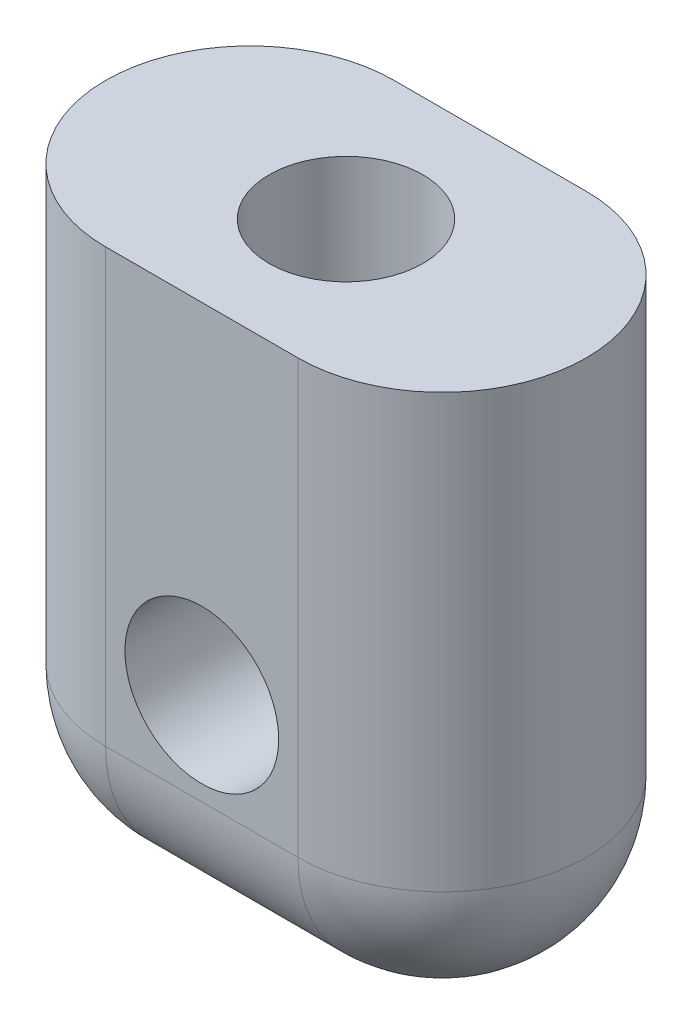
ISO-10303-21;
HEADER;
FILE_DESCRIPTION(('STEP AP214'),'2;1');
FILE_NAME('part.step','',(''),(''),'','','');
FILE_SCHEMA(('AUTOMOTIVE_DESIGN { 1 0 10303 214 1 1 1 1 }'));
ENDSEC;
DATA;
#1=APPLICATION_CONTEXT('core data for automotive mechanical design processes');
#2=APPLICATION_PROTOCOL_DEFINITION('international standard','automotive_design',2000,#1);
#3=PRODUCT_CONTEXT('',#1,'mechanical');
#4=PRODUCT('Part','Part','',(#3));
#5=PRODUCT_RELATED_PRODUCT_CATEGORY('part','',(#4));
#6=PRODUCT_DEFINITION_FORMATION('','',#4);
#7=PRODUCT_DEFINITION_CONTEXT('part definition',#1,'design');
#8=PRODUCT_DEFINITION('design','',#6,#7);
#9=PRODUCT_DEFINITION_SHAPE('','',#8);
#10=(LENGTH_UNIT() NAMED_UNIT(*) SI_UNIT(.MILLI.,.METRE.));
#11=(NAMED_UNIT(*) PLANE_ANGLE_UNIT() SI_UNIT($,.RADIAN.));
#12=(NAMED_UNIT(*) SI_UNIT($,.STERADIAN.) SOLID_ANGLE_UNIT());
#13=UNCERTAINTY_MEASURE_WITH_UNIT(LENGTH_MEASURE(1.E-05),#10,'distance_accuracy_value','');
#14=(GEOMETRIC_REPRESENTATION_CONTEXT(3) GLOBAL_UNCERTAINTY_ASSIGNED_CONTEXT((#13)) GLOBAL_UNIT_ASSIGNED_CONTEXT((#10,
#11,#12)) REPRESENTATION_CONTEXT('',''));
#15=CARTESIAN_POINT('',(0.,0.,0.));
#16=DIRECTION('',(0.,0.,1.));
#17=DIRECTION('',(1.,0.,0.));
#18=AXIS2_PLACEMENT_3D('',#15,#16,#17);
#19=CARTESIAN_POINT('',(0.,12.,0.));
#20=DIRECTION('',(0.,-1.,0.));
#21=DIRECTION('',(0.,0.,-1.));
#22=AXIS2_PLACEMENT_3D('',#19,#20,#21);
#23=CYLINDRICAL_SURFACE('',#22,3.);
#24=DIRECTION('',(0.,-1.,0.));
#25=VECTOR('',#24,1.);
#26=CARTESIAN_POINT('',(0.,12.,-3.));
#27=LINE('',#26,#25);
#28=CARTESIAN_POINT('',(0.,12.,-3.));
#29=VERTEX_POINT('',#28);
#30=CARTESIAN_POINT('',(0.,3.,-3.));
#31=VERTEX_POINT('',#30);
#32=EDGE_CURVE('E134',#29,#31,#27,.T.);
#33=ORIENTED_EDGE('',*,*,#32,.T.);
#34=CARTESIAN_POINT('',(0.,3.,0.));
#35=DIRECTION('',(0.,-1.,0.));
#36=DIRECTION('',(0.,0.,-1.));
#37=AXIS2_PLACEMENT_3D('',#34,#35,#36);
#38=CIRCLE('',#37,3.);
#39=CARTESIAN_POINT('',(0.,3.,3.));
#40=VERTEX_POINT('',#39);
#41=EDGE_CURVE('E54',#31,#40,#38,.F.);
#42=ORIENTED_EDGE('',*,*,#41,.T.);
#43=DIRECTION('',(0.,-1.,0.));
#44=VECTOR('',#43,1.);
#45=CARTESIAN_POINT('',(0.,12.,3.));
#46=LINE('',#45,#44);
#47=CARTESIAN_POINT('',(0.,12.,3.));
#48=VERTEX_POINT('',#47);
#49=EDGE_CURVE('E145',#48,#40,#46,.T.);
#50=ORIENTED_EDGE('',*,*,#49,.F.);
#51=CARTESIAN_POINT('',(0.,12.,0.));
#52=DIRECTION('',(0.,1.,0.));
#53=DIRECTION('',(0.,0.,1.));
#54=AXIS2_PLACEMENT_3D('',#51,#52,#53);
#55=CIRCLE('',#54,3.);
#56=EDGE_CURVE('E113',#29,#48,#55,.T.);
#57=ORIENTED_EDGE('',*,*,#56,.F.);
#58=EDGE_LOOP('',(#33,#42,#50,#57));
#59=FACE_BOUND('',#58,.T.);
#60=ADVANCED_FACE('F43',(#59),#23,.T.);
#61=CARTESIAN_POINT('',(0.,12.,3.));
#62=DIRECTION('',(0.,0.,-1.));
#63=DIRECTION('',(-1.,0.,0.));
#64=AXIS2_PLACEMENT_3D('',#61,#62,#63);
#65=PLANE('',#64);
#66=CARTESIAN_POINT('',(2.,4.92597462682934,3.));
#67=DIRECTION('',(0.,0.,1.));
#68=DIRECTION('',(1.,0.,0.));
#69=AXIS2_PLACEMENT_3D('',#66,#67,#68);
#70=CIRCLE('',#69,1.6);
#71=CARTESIAN_POINT('',(3.6,4.92597462682934,3.));
#72=VERTEX_POINT('',#71);
#73=EDGE_CURVE('E110',#72,#72,#70,.T.);
#74=ORIENTED_EDGE('',*,*,#73,.F.);
#75=EDGE_LOOP('',(#74));
#76=FACE_BOUND('',#75,.T.);
#77=ORIENTED_EDGE('',*,*,#49,.T.);
#78=DIRECTION('',(1.,0.,0.));
#79=VECTOR('',#78,1.);
#80=CARTESIAN_POINT('',(0.,3.,3.));
#81=LINE('',#80,#79);
#82=CARTESIAN_POINT('',(4.,3.,3.));
#83=VERTEX_POINT('',#82);
#84=EDGE_CURVE('E88',#40,#83,#81,.T.);
#85=ORIENTED_EDGE('',*,*,#84,.T.);
#86=DIRECTION('',(0.,-1.,0.));
#87=VECTOR('',#86,1.);
#88=CARTESIAN_POINT('',(4.,12.,3.));
#89=LINE('',#88,#87);
#90=CARTESIAN_POINT('',(4.,12.,3.));
#91=VERTEX_POINT('',#90);
#92=EDGE_CURVE('E141',#91,#83,#89,.T.);
#93=ORIENTED_EDGE('',*,*,#92,.F.);
#94=DIRECTION('',(1.,0.,0.));
#95=VECTOR('',#94,1.);
#96=CARTESIAN_POINT('',(0.,12.,3.));
#97=LINE('',#96,#95);
#98=EDGE_CURVE('E116',#48,#91,#97,.T.);
#99=ORIENTED_EDGE('',*,*,#98,.F.);
#100=EDGE_LOOP('',(#77,#85,#93,#99));
#101=FACE_BOUND('',#100,.T.);
#102=ADVANCED_FACE('F155',(#76,#101),#65,.F.);
#103=CARTESIAN_POINT('',(4.,12.,0.));
#104=DIRECTION('',(0.,-1.,0.));
#105=DIRECTION('',(0.,0.,-1.));
#106=AXIS2_PLACEMENT_3D('',#103,#104,#105);
#107=CYLINDRICAL_SURFACE('',#106,3.);
#108=ORIENTED_EDGE('',*,*,#92,.T.);
#109=CARTESIAN_POINT('',(4.,3.,0.));
#110=DIRECTION('',(0.,-1.,0.));
#111=DIRECTION('',(0.,0.,-1.));
#112=AXIS2_PLACEMENT_3D('',#109,#110,#111);
#113=CIRCLE('',#112,3.);
#114=CARTESIAN_POINT('',(4.,3.,-3.));
#115=VERTEX_POINT('',#114);
#116=EDGE_CURVE('E11',#83,#115,#113,.F.);
#117=ORIENTED_EDGE('',*,*,#116,.T.);
#118=DIRECTION('',(0.,-1.,0.));
#119=VECTOR('',#118,1.);
#120=CARTESIAN_POINT('',(4.,12.,-3.));
#121=LINE('',#120,#119);
#122=CARTESIAN_POINT('',(4.,12.,-3.));
#123=VERTEX_POINT('',#122);
#124=EDGE_CURVE('E137',#123,#115,#121,.T.);
#125=ORIENTED_EDGE('',*,*,#124,.F.);
#126=CARTESIAN_POINT('',(4.,12.,0.));
#127=DIRECTION('',(0.,1.,0.));
#128=DIRECTION('',(0.,0.,1.));
#129=AXIS2_PLACEMENT_3D('',#126,#127,#128);
#130=CIRCLE('',#129,3.);
#131=EDGE_CURVE('E123',#91,#123,#130,.T.);
#132=ORIENTED_EDGE('',*,*,#131,.F.);
#133=EDGE_LOOP('',(#108,#117,#125,#132));
#134=FACE_BOUND('',#133,.T.);
#135=ADVANCED_FACE('F158',(#134),#107,.T.);
#136=CARTESIAN_POINT('',(0.,12.,-3.));
#137=DIRECTION('',(0.,0.,1.));
#138=DIRECTION('',(1.,0.,0.));
#139=AXIS2_PLACEMENT_3D('',#136,#137,#138);
#140=PLANE('',#139);
#141=CARTESIAN_POINT('',(2.,4.92597462682934,-3.));
#142=DIRECTION('',(0.,0.,1.));
#143=DIRECTION('',(1.,0.,0.));
#144=AXIS2_PLACEMENT_3D('',#141,#142,#143);
#145=CIRCLE('',#144,1.6);
#146=CARTESIAN_POINT('',(3.6,4.92597462682934,-3.));
#147=VERTEX_POINT('',#146);
#148=EDGE_CURVE('E47',#147,#147,#145,.T.);
#149=ORIENTED_EDGE('',*,*,#148,.T.);
#150=EDGE_LOOP('',(#149));
#151=FACE_BOUND('',#150,.T.);
#152=ORIENTED_EDGE('',*,*,#124,.T.);
#153=DIRECTION('',(-1.,0.,0.));
#154=VECTOR('',#153,1.);
#155=CARTESIAN_POINT('',(0.,3.,-3.));
#156=LINE('',#155,#154);
#157=EDGE_CURVE('E148',#115,#31,#156,.T.);
#158=ORIENTED_EDGE('',*,*,#157,.T.);
#159=ORIENTED_EDGE('',*,*,#32,.F.);
#160=DIRECTION('',(-1.,0.,0.));
#161=VECTOR('',#160,1.);
#162=CARTESIAN_POINT('',(0.,12.,-3.));
#163=LINE('',#162,#161);
#164=EDGE_CURVE('E131',#123,#29,#163,.T.);
#165=ORIENTED_EDGE('',*,*,#164,.F.);
#166=EDGE_LOOP('',(#152,#158,#159,#165));
#167=FACE_BOUND('',#166,.T.);
#168=ADVANCED_FACE('F163',(#151,#167),#140,.F.);
#169=CARTESIAN_POINT('',(0.,12.,0.));
#170=DIRECTION('',(0.,1.,0.));
#171=DIRECTION('',(0.,0.,1.));
#172=AXIS2_PLACEMENT_3D('',#169,#170,#171);
#173=PLANE('',#172);
#174=CARTESIAN_POINT('',(2.,12.,0.));
#175=DIRECTION('',(0.,1.,0.));
#176=DIRECTION('',(0.,0.,1.));
#177=AXIS2_PLACEMENT_3D('',#174,#175,#176);
#178=CIRCLE('',#177,1.6);
#179=CARTESIAN_POINT('',(2.,12.,1.6));
#180=VERTEX_POINT('',#179);
#181=EDGE_CURVE('E304',#180,#180,#178,.T.);
#182=ORIENTED_EDGE('',*,*,#181,.F.);
#183=EDGE_LOOP('',(#182));
#184=FACE_BOUND('',#183,.T.);
#185=ORIENTED_EDGE('',*,*,#56,.T.);
#186=ORIENTED_EDGE('',*,*,#98,.T.);
#187=ORIENTED_EDGE('',*,*,#131,.T.);
#188=ORIENTED_EDGE('',*,*,#164,.T.);
#189=EDGE_LOOP('',(#185,#186,#187,#188));
#190=FACE_BOUND('',#189,.T.);
#191=ADVANCED_FACE('F171',(#184,#190),#173,.T.);
#192=CARTESIAN_POINT('',(0.,3.,0.));
#193=DIRECTION('',(1.,0.,0.));
#194=DIRECTION('',(0.,0.,-1.));
#195=AXIS2_PLACEMENT_3D('',#192,#193,#194);
#196=CYLINDRICAL_SURFACE('',#195,3.);
#197=CARTESIAN_POINT('',(4.,3.,0.));
#198=DIRECTION('',(1.,0.,0.));
#199=DIRECTION('',(0.,0.,-1.));
#200=AXIS2_PLACEMENT_3D('',#197,#198,#199);
#201=CIRCLE('',#200,3.);
#202=CARTESIAN_POINT('',(4.,0.,0.));
#203=VERTEX_POINT('',#202);
#204=EDGE_CURVE('E75',#83,#203,#201,.T.);
#205=ORIENTED_EDGE('',*,*,#204,.F.);
#206=ORIENTED_EDGE('',*,*,#84,.F.);
#207=CARTESIAN_POINT('',(0.,3.,0.));
#208=DIRECTION('',(-1.,0.,0.));
#209=DIRECTION('',(0.,0.,1.));
#210=AXIS2_PLACEMENT_3D('',#207,#208,#209);
#211=CIRCLE('',#210,3.);
#212=CARTESIAN_POINT('',(0.,0.,0.));
#213=VERTEX_POINT('',#212);
#214=EDGE_CURVE('E84',#213,#40,#211,.T.);
#215=ORIENTED_EDGE('',*,*,#214,.F.);
#216=DIRECTION('',(1.,0.,0.));
#217=VECTOR('',#216,1.);
#218=CARTESIAN_POINT('',(0.,0.,0.));
#219=LINE('',#218,#217);
#220=EDGE_CURVE('E86',#203,#213,#219,.F.);
#221=ORIENTED_EDGE('',*,*,#220,.F.);
#222=EDGE_LOOP('',(#205,#206,#215,#221));
#223=FACE_BOUND('',#222,.T.);
#224=ADVANCED_FACE('F45',(#223),#196,.T.);
#225=CARTESIAN_POINT('',(4.,3.,0.));
#226=DIRECTION('',(0.,1.,0.));
#227=DIRECTION('',(0.,0.,1.));
#228=AXIS2_PLACEMENT_3D('',#225,#226,#227);
#229=SPHERICAL_SURFACE('',#228,3.);
#230=ORIENTED_EDGE('',*,*,#116,.F.);
#231=ORIENTED_EDGE('',*,*,#204,.T.);
#232=CARTESIAN_POINT('',(4.,3.,0.));
#233=DIRECTION('',(-1.,0.,0.));
#234=DIRECTION('',(0.,0.,1.));
#235=AXIS2_PLACEMENT_3D('',#232,#233,#234);
#236=CIRCLE('',#235,3.);
#237=EDGE_CURVE('E99',#115,#203,#236,.T.);
#238=ORIENTED_EDGE('',*,*,#237,.F.);
#239=EDGE_LOOP('',(#230,#231,#238));
#240=FACE_BOUND('',#239,.T.);
#241=ADVANCED_FACE('F160',(#240),#229,.T.);
#242=CARTESIAN_POINT('',(0.,3.,0.));
#243=DIRECTION('',(0.,1.,0.));
#244=DIRECTION('',(0.,0.,1.));
#245=AXIS2_PLACEMENT_3D('',#242,#243,#244);
#246=SPHERICAL_SURFACE('',#245,3.);
#247=ORIENTED_EDGE('',*,*,#214,.T.);
#248=ORIENTED_EDGE('',*,*,#41,.F.);
#249=CARTESIAN_POINT('',(0.,3.,0.));
#250=DIRECTION('',(1.,0.,0.));
#251=DIRECTION('',(0.,0.,-1.));
#252=AXIS2_PLACEMENT_3D('',#249,#250,#251);
#253=CIRCLE('',#252,3.);
#254=EDGE_CURVE('E98',#213,#31,#253,.T.);
#255=ORIENTED_EDGE('',*,*,#254,.F.);
#256=EDGE_LOOP('',(#247,#248,#255));
#257=FACE_BOUND('',#256,.T.);
#258=ADVANCED_FACE('F102',(#257),#246,.T.);
#259=CARTESIAN_POINT('',(0.,3.,0.));
#260=DIRECTION('',(-1.,0.,0.));
#261=DIRECTION('',(0.,0.,1.));
#262=AXIS2_PLACEMENT_3D('',#259,#260,#261);
#263=CYLINDRICAL_SURFACE('',#262,3.);
#264=ORIENTED_EDGE('',*,*,#237,.T.);
#265=ORIENTED_EDGE('',*,*,#220,.T.);
#266=ORIENTED_EDGE('',*,*,#254,.T.);
#267=ORIENTED_EDGE('',*,*,#157,.F.);
#268=EDGE_LOOP('',(#264,#265,#266,#267));
#269=FACE_BOUND('',#268,.T.);
#270=ADVANCED_FACE('F95',(#269),#263,.T.);
#271=CARTESIAN_POINT('',(2.,4.92597462682934,-17.));
#272=DIRECTION('',(0.,0.,1.));
#273=DIRECTION('',(1.,0.,0.));
#274=AXIS2_PLACEMENT_3D('',#271,#272,#273);
#275=CYLINDRICAL_SURFACE('',#274,1.6);
#276=ORIENTED_EDGE('',*,*,#73,.T.);
#277=EDGE_LOOP('',(#276));
#278=FACE_BOUND('',#277,.T.);
#279=ORIENTED_EDGE('',*,*,#148,.F.);
#280=EDGE_LOOP('',(#279));
#281=FACE_BOUND('',#280,.T.);
#282=ADVANCED_FACE('F194',(#278,#281),#275,.F.);
#283=CARTESIAN_POINT('',(2.,8.,0.));
#284=DIRECTION('',(0.,1.,0.));
#285=DIRECTION('',(0.,0.,1.));
#286=AXIS2_PLACEMENT_3D('',#283,#284,#285);
#287=CYLINDRICAL_SURFACE('',#286,1.6);
#288=CARTESIAN_POINT('',(2.,8.,0.));
#289=DIRECTION('',(0.,1.,0.));
#290=DIRECTION('',(0.,0.,1.));
#291=AXIS2_PLACEMENT_3D('',#288,#289,#290);
#292=CIRCLE('',#291,1.6);
#293=CARTESIAN_POINT('',(2.,8.,1.6));
#294=VERTEX_POINT('',#293);
#295=EDGE_CURVE('E302',#294,#294,#292,.T.);
#296=ORIENTED_EDGE('',*,*,#295,.F.);
#297=EDGE_LOOP('',(#296));
#298=FACE_BOUND('',#297,.T.);
#299=ORIENTED_EDGE('',*,*,#181,.T.);
#300=EDGE_LOOP('',(#299));
#301=FACE_BOUND('',#300,.T.);
#302=ADVANCED_FACE('F216',(#298,#301),#287,.F.);
#303=CARTESIAN_POINT('',(2.,8.,0.));
#304=DIRECTION('',(0.,1.,0.));
#305=DIRECTION('',(0.,0.,1.));
#306=AXIS2_PLACEMENT_3D('',#303,#304,#305);
#307=PLANE('',#306);
#308=ORIENTED_EDGE('',*,*,#295,.T.);
#309=EDGE_LOOP('',(#308));
#310=FACE_BOUND('',#309,.T.);
#311=ADVANCED_FACE('F224',(#310),#307,.T.);
#312=CLOSED_SHELL('',(#60,#102,#135,#168,#191,#224,#241,#258,#270,#282,#302,#311));
#313=MANIFOLD_SOLID_BREP('B2',#312);
#314=ADVANCED_BREP_SHAPE_REPRESENTATION('',(#18,#313),#14);
#315=SHAPE_DEFINITION_REPRESENTATION(#9,#314);
ENDSEC;
END-ISO-10303-21;
